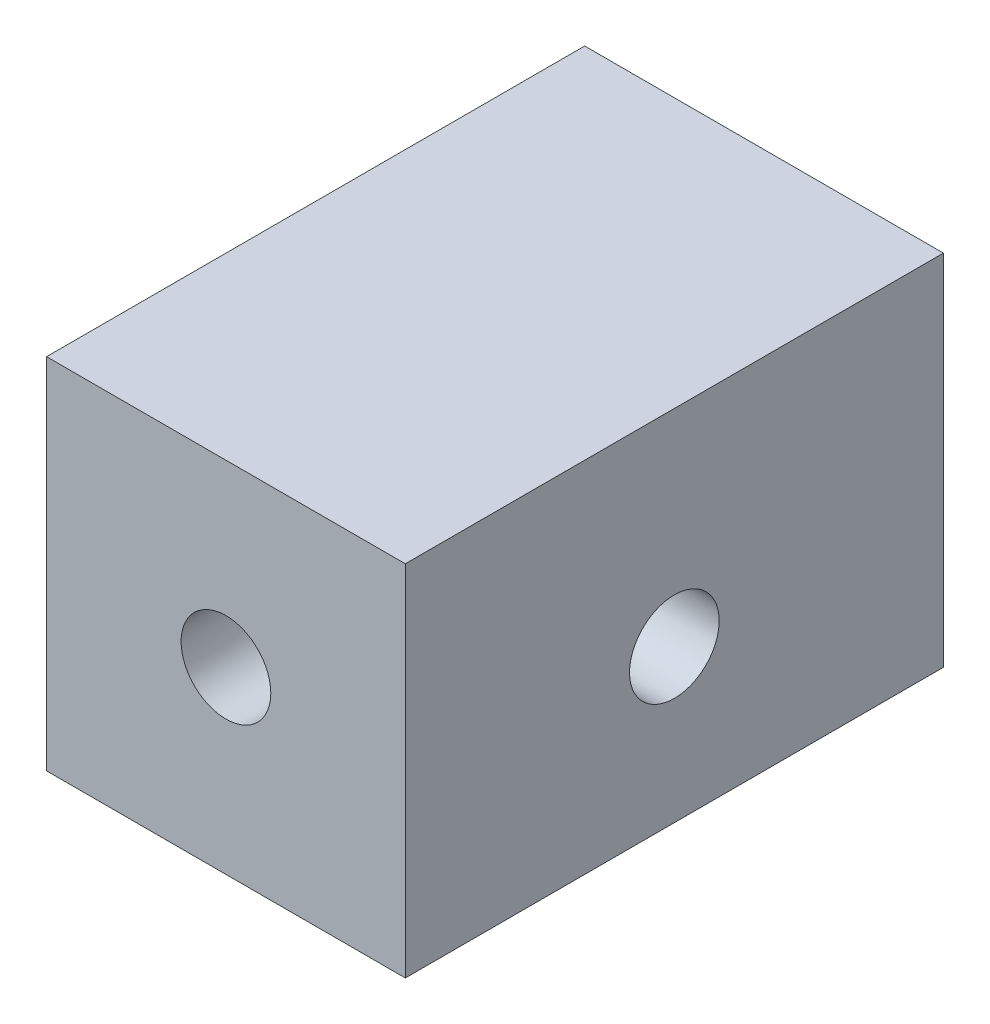
ISO-10303-21;
HEADER;
FILE_DESCRIPTION(('STEP AP214'),'2;1');
FILE_NAME('part.step','',(''),(''),'','','');
FILE_SCHEMA(('AUTOMOTIVE_DESIGN { 1 0 10303 214 1 1 1 1 }'));
ENDSEC;
DATA;
#1=APPLICATION_CONTEXT('core data for automotive mechanical design processes');
#2=APPLICATION_PROTOCOL_DEFINITION('international standard','automotive_design',2000,#1);
#3=PRODUCT_CONTEXT('',#1,'mechanical');
#4=PRODUCT('Part','Part','',(#3));
#5=PRODUCT_RELATED_PRODUCT_CATEGORY('part','',(#4));
#6=PRODUCT_DEFINITION_FORMATION('','',#4);
#7=PRODUCT_DEFINITION_CONTEXT('part definition',#1,'design');
#8=PRODUCT_DEFINITION('design','',#6,#7);
#9=PRODUCT_DEFINITION_SHAPE('','',#8);
#10=(LENGTH_UNIT() NAMED_UNIT(*) SI_UNIT(.MILLI.,.METRE.));
#11=(NAMED_UNIT(*) PLANE_ANGLE_UNIT() SI_UNIT($,.RADIAN.));
#12=(NAMED_UNIT(*) SI_UNIT($,.STERADIAN.) SOLID_ANGLE_UNIT());
#13=UNCERTAINTY_MEASURE_WITH_UNIT(LENGTH_MEASURE(1.E-05),#10,'distance_accuracy_value','');
#14=(GEOMETRIC_REPRESENTATION_CONTEXT(3) GLOBAL_UNCERTAINTY_ASSIGNED_CONTEXT((#13)) GLOBAL_UNIT_ASSIGNED_CONTEXT((#10,
#11,#12)) REPRESENTATION_CONTEXT('',''));
#15=CARTESIAN_POINT('',(0.,0.,0.));
#16=DIRECTION('',(0.,0.,1.));
#17=DIRECTION('',(1.,0.,0.));
#18=AXIS2_PLACEMENT_3D('',#15,#16,#17);
#19=CARTESIAN_POINT('',(12.7,-12.7,38.1));
#20=DIRECTION('',(-1.,0.,0.));
#21=DIRECTION('',(0.,0.,1.));
#22=AXIS2_PLACEMENT_3D('',#19,#20,#21);
#23=PLANE('',#22);
#24=CARTESIAN_POINT('',(12.7,-1.905,19.05));
#25=DIRECTION('',(-1.,0.,0.));
#26=DIRECTION('',(0.,0.,1.));
#27=AXIS2_PLACEMENT_3D('',#24,#25,#26);
#28=CIRCLE('',#27,3.17500000000001);
#29=CARTESIAN_POINT('',(12.7,-1.905,22.225));
#30=VERTEX_POINT('',#29);
#31=EDGE_CURVE('E112',#30,#30,#28,.T.);
#32=ORIENTED_EDGE('',*,*,#31,.T.);
#33=EDGE_LOOP('',(#32));
#34=FACE_BOUND('',#33,.T.);
#35=DIRECTION('',(0.,1.,0.));
#36=VECTOR('',#35,1.);
#37=CARTESIAN_POINT('',(12.7,-12.7,0.));
#38=LINE('',#37,#36);
#39=CARTESIAN_POINT('',(12.7,-12.7,0.));
#40=VERTEX_POINT('',#39);
#41=CARTESIAN_POINT('',(12.7,12.7,0.));
#42=VERTEX_POINT('',#41);
#43=EDGE_CURVE('E95',#40,#42,#38,.T.);
#44=ORIENTED_EDGE('',*,*,#43,.T.);
#45=DIRECTION('',(0.,0.,-1.));
#46=VECTOR('',#45,1.);
#47=CARTESIAN_POINT('',(12.7,12.7,38.1));
#48=LINE('',#47,#46);
#49=CARTESIAN_POINT('',(12.7,12.7,38.1));
#50=VERTEX_POINT('',#49);
#51=EDGE_CURVE('E11',#50,#42,#48,.T.);
#52=ORIENTED_EDGE('',*,*,#51,.F.);
#53=DIRECTION('',(0.,1.,0.));
#54=VECTOR('',#53,1.);
#55=CARTESIAN_POINT('',(12.7,-12.7,38.1));
#56=LINE('',#55,#54);
#57=CARTESIAN_POINT('',(12.7,-12.7,38.1));
#58=VERTEX_POINT('',#57);
#59=EDGE_CURVE('E83',#58,#50,#56,.T.);
#60=ORIENTED_EDGE('',*,*,#59,.F.);
#61=DIRECTION('',(0.,0.,-1.));
#62=VECTOR('',#61,1.);
#63=CARTESIAN_POINT('',(12.7,-12.7,38.1));
#64=LINE('',#63,#62);
#65=EDGE_CURVE('E91',#58,#40,#64,.T.);
#66=ORIENTED_EDGE('',*,*,#65,.T.);
#67=EDGE_LOOP('',(#44,#52,#60,#66));
#68=FACE_BOUND('',#67,.T.);
#69=ADVANCED_FACE('F32',(#34,#68),#23,.F.);
#70=CARTESIAN_POINT('',(-12.7,12.7,38.1));
#71=DIRECTION('',(0.,-1.,0.));
#72=DIRECTION('',(0.,0.,-1.));
#73=AXIS2_PLACEMENT_3D('',#70,#71,#72);
#74=PLANE('',#73);
#75=DIRECTION('',(-1.,0.,0.));
#76=VECTOR('',#75,1.);
#77=CARTESIAN_POINT('',(-12.7,12.7,0.));
#78=LINE('',#77,#76);
#79=CARTESIAN_POINT('',(-12.7,12.7,0.));
#80=VERTEX_POINT('',#79);
#81=EDGE_CURVE('E87',#42,#80,#78,.T.);
#82=ORIENTED_EDGE('',*,*,#81,.T.);
#83=DIRECTION('',(0.,0.,-1.));
#84=VECTOR('',#83,1.);
#85=CARTESIAN_POINT('',(-12.7,12.7,38.1));
#86=LINE('',#85,#84);
#87=CARTESIAN_POINT('',(-12.7,12.7,38.1));
#88=VERTEX_POINT('',#87);
#89=EDGE_CURVE('E40',#88,#80,#86,.T.);
#90=ORIENTED_EDGE('',*,*,#89,.F.);
#91=DIRECTION('',(-1.,0.,0.));
#92=VECTOR('',#91,1.);
#93=CARTESIAN_POINT('',(-12.7,12.7,38.1));
#94=LINE('',#93,#92);
#95=EDGE_CURVE('E78',#50,#88,#94,.T.);
#96=ORIENTED_EDGE('',*,*,#95,.F.);
#97=ORIENTED_EDGE('',*,*,#51,.T.);
#98=EDGE_LOOP('',(#82,#90,#96,#97));
#99=FACE_BOUND('',#98,.T.);
#100=ADVANCED_FACE('F86',(#99),#74,.F.);
#101=CARTESIAN_POINT('',(-12.7,-12.7,38.1));
#102=DIRECTION('',(1.,0.,0.));
#103=DIRECTION('',(0.,0.,-1.));
#104=AXIS2_PLACEMENT_3D('',#101,#102,#103);
#105=PLANE('',#104);
#106=CARTESIAN_POINT('',(-12.7,-1.905,19.05));
#107=DIRECTION('',(-1.,0.,0.));
#108=DIRECTION('',(0.,0.,1.));
#109=AXIS2_PLACEMENT_3D('',#106,#107,#108);
#110=CIRCLE('',#109,3.17500000000001);
#111=CARTESIAN_POINT('',(-12.7,-1.905,22.225));
#112=VERTEX_POINT('',#111);
#113=EDGE_CURVE('E115',#112,#112,#110,.T.);
#114=ORIENTED_EDGE('',*,*,#113,.F.);
#115=EDGE_LOOP('',(#114));
#116=FACE_BOUND('',#115,.T.);
#117=DIRECTION('',(0.,-1.,0.));
#118=VECTOR('',#117,1.);
#119=CARTESIAN_POINT('',(-12.7,-12.7,0.));
#120=LINE('',#119,#118);
#121=CARTESIAN_POINT('',(-12.7,-12.7,0.));
#122=VERTEX_POINT('',#121);
#123=EDGE_CURVE('E65',#80,#122,#120,.T.);
#124=ORIENTED_EDGE('',*,*,#123,.T.);
#125=DIRECTION('',(0.,0.,-1.));
#126=VECTOR('',#125,1.);
#127=CARTESIAN_POINT('',(-12.7,-12.7,38.1));
#128=LINE('',#127,#126);
#129=CARTESIAN_POINT('',(-12.7,-12.7,38.1));
#130=VERTEX_POINT('',#129);
#131=EDGE_CURVE('E88',#130,#122,#128,.T.);
#132=ORIENTED_EDGE('',*,*,#131,.F.);
#133=DIRECTION('',(0.,-1.,0.));
#134=VECTOR('',#133,1.);
#135=CARTESIAN_POINT('',(-12.7,-12.7,38.1));
#136=LINE('',#135,#134);
#137=EDGE_CURVE('E81',#88,#130,#136,.T.);
#138=ORIENTED_EDGE('',*,*,#137,.F.);
#139=ORIENTED_EDGE('',*,*,#89,.T.);
#140=EDGE_LOOP('',(#124,#132,#138,#139));
#141=FACE_BOUND('',#140,.T.);
#142=ADVANCED_FACE('F89',(#116,#141),#105,.F.);
#143=CARTESIAN_POINT('',(-12.7,-12.7,38.1));
#144=DIRECTION('',(0.,1.,0.));
#145=DIRECTION('',(0.,0.,1.));
#146=AXIS2_PLACEMENT_3D('',#143,#144,#145);
#147=PLANE('',#146);
#148=DIRECTION('',(1.,0.,0.));
#149=VECTOR('',#148,1.);
#150=CARTESIAN_POINT('',(-12.7,-12.7,0.));
#151=LINE('',#150,#149);
#152=EDGE_CURVE('E71',#122,#40,#151,.T.);
#153=ORIENTED_EDGE('',*,*,#152,.T.);
#154=ORIENTED_EDGE('',*,*,#65,.F.);
#155=DIRECTION('',(1.,0.,0.));
#156=VECTOR('',#155,1.);
#157=CARTESIAN_POINT('',(-12.7,-12.7,38.1));
#158=LINE('',#157,#156);
#159=EDGE_CURVE('E48',#130,#58,#158,.T.);
#160=ORIENTED_EDGE('',*,*,#159,.F.);
#161=ORIENTED_EDGE('',*,*,#131,.T.);
#162=EDGE_LOOP('',(#153,#154,#160,#161));
#163=FACE_BOUND('',#162,.T.);
#164=ADVANCED_FACE('F103',(#163),#147,.F.);
#165=CARTESIAN_POINT('',(0.,0.,38.1));
#166=DIRECTION('',(0.,0.,-1.));
#167=DIRECTION('',(-1.,0.,0.));
#168=AXIS2_PLACEMENT_3D('',#165,#166,#167);
#169=PLANE('',#168);
#170=CARTESIAN_POINT('',(0.,0.,38.1));
#171=DIRECTION('',(0.,0.,1.));
#172=DIRECTION('',(1.,0.,0.));
#173=AXIS2_PLACEMENT_3D('',#170,#171,#172);
#174=CIRCLE('',#173,3.175);
#175=CARTESIAN_POINT('',(3.175,0.,38.1));
#176=VERTEX_POINT('',#175);
#177=EDGE_CURVE('E109',#176,#176,#174,.T.);
#178=ORIENTED_EDGE('',*,*,#177,.F.);
#179=EDGE_LOOP('',(#178));
#180=FACE_BOUND('',#179,.T.);
#181=ORIENTED_EDGE('',*,*,#59,.T.);
#182=ORIENTED_EDGE('',*,*,#95,.T.);
#183=ORIENTED_EDGE('',*,*,#137,.T.);
#184=ORIENTED_EDGE('',*,*,#159,.T.);
#185=EDGE_LOOP('',(#181,#182,#183,#184));
#186=FACE_BOUND('',#185,.T.);
#187=ADVANCED_FACE('F79',(#180,#186),#169,.F.);
#188=CARTESIAN_POINT('',(0.,0.,0.));
#189=DIRECTION('',(0.,0.,-1.));
#190=DIRECTION('',(-1.,0.,0.));
#191=AXIS2_PLACEMENT_3D('',#188,#189,#190);
#192=PLANE('',#191);
#193=ORIENTED_EDGE('',*,*,#43,.F.);
#194=ORIENTED_EDGE('',*,*,#152,.F.);
#195=ORIENTED_EDGE('',*,*,#123,.F.);
#196=ORIENTED_EDGE('',*,*,#81,.F.);
#197=EDGE_LOOP('',(#193,#194,#195,#196));
#198=FACE_BOUND('',#197,.T.);
#199=ADVANCED_FACE('F106',(#198),#192,.T.);
#200=CARTESIAN_POINT('',(0.,0.,25.4));
#201=DIRECTION('',(0.,0.,1.));
#202=DIRECTION('',(1.,0.,0.));
#203=AXIS2_PLACEMENT_3D('',#200,#201,#202);
#204=CYLINDRICAL_SURFACE('',#203,3.175);
#205=CARTESIAN_POINT('',(0.,0.,25.4));
#206=DIRECTION('',(0.,0.,1.));
#207=DIRECTION('',(1.,0.,0.));
#208=AXIS2_PLACEMENT_3D('',#205,#206,#207);
#209=CIRCLE('',#208,3.175);
#210=CARTESIAN_POINT('',(3.175,0.,25.4));
#211=VERTEX_POINT('',#210);
#212=EDGE_CURVE('E98',#211,#211,#209,.T.);
#213=ORIENTED_EDGE('',*,*,#212,.F.);
#214=EDGE_LOOP('',(#213));
#215=FACE_BOUND('',#214,.T.);
#216=ORIENTED_EDGE('',*,*,#177,.T.);
#217=EDGE_LOOP('',(#216));
#218=FACE_BOUND('',#217,.T.);
#219=ADVANCED_FACE('F162',(#215,#218),#204,.F.);
#220=CARTESIAN_POINT('',(0.,0.,25.4));
#221=DIRECTION('',(0.,0.,1.));
#222=DIRECTION('',(1.,0.,0.));
#223=AXIS2_PLACEMENT_3D('',#220,#221,#222);
#224=PLANE('',#223);
#225=ORIENTED_EDGE('',*,*,#212,.T.);
#226=EDGE_LOOP('',(#225));
#227=FACE_BOUND('',#226,.T.);
#228=ADVANCED_FACE('F125',(#227),#224,.T.);
#229=CARTESIAN_POINT('',(12.7,-1.905,19.05));
#230=DIRECTION('',(-1.,0.,0.));
#231=DIRECTION('',(0.,0.,1.));
#232=AXIS2_PLACEMENT_3D('',#229,#230,#231);
#233=CYLINDRICAL_SURFACE('',#232,3.17500000000001);
#234=ORIENTED_EDGE('',*,*,#31,.F.);
#235=EDGE_LOOP('',(#234));
#236=FACE_BOUND('',#235,.T.);
#237=ORIENTED_EDGE('',*,*,#113,.T.);
#238=EDGE_LOOP('',(#237));
#239=FACE_BOUND('',#238,.T.);
#240=ADVANCED_FACE('F122',(#236,#239),#233,.F.);
#241=CLOSED_SHELL('',(#69,#100,#142,#164,#187,#199,#219,#228,#240));
#242=MANIFOLD_SOLID_BREP('B2',#241);
#243=ADVANCED_BREP_SHAPE_REPRESENTATION('',(#18,#242),#14);
#244=SHAPE_DEFINITION_REPRESENTATION(#9,#243);
ENDSEC;
END-ISO-10303-21;
